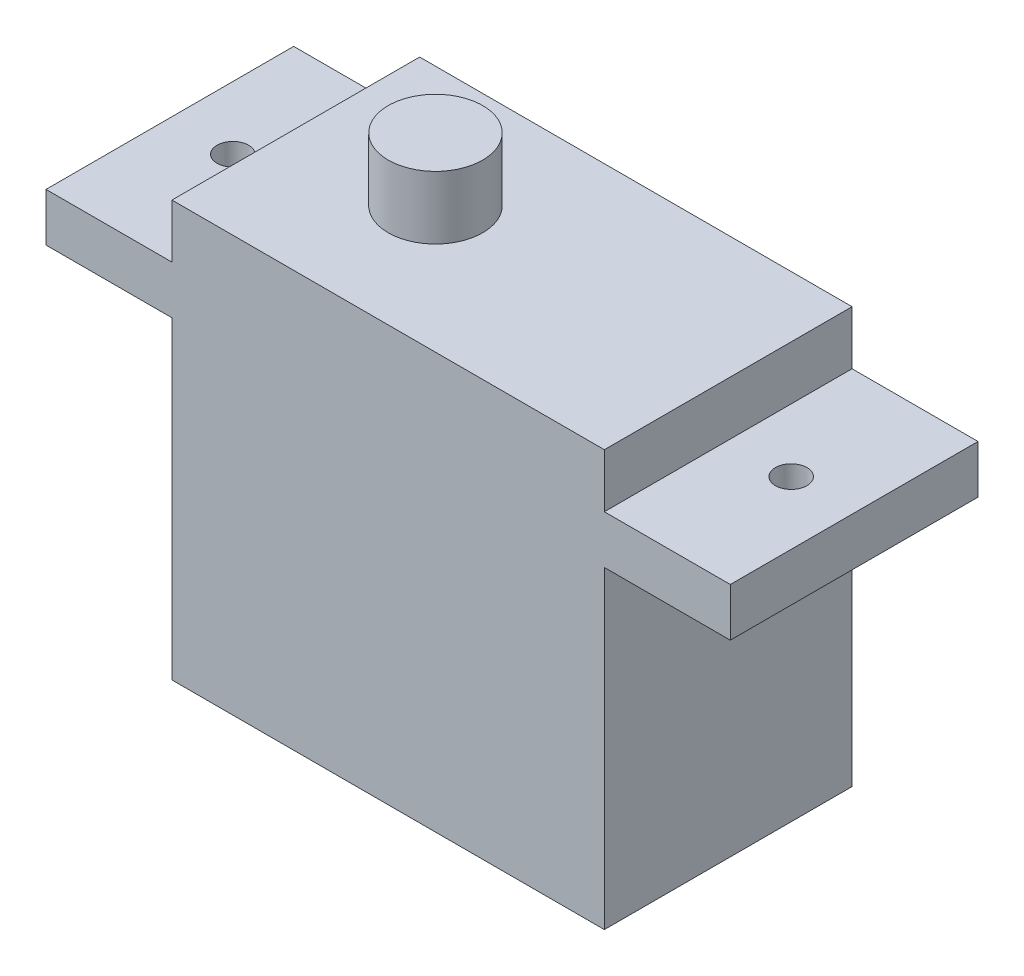
ISO-10303-21;
HEADER;
FILE_DESCRIPTION(('STEP AP214'),'2;1');
FILE_NAME('part.step','',(''),(''),'','','');
FILE_SCHEMA(('AUTOMOTIVE_DESIGN { 1 0 10303 214 1 1 1 1 }'));
ENDSEC;
DATA;
#1=APPLICATION_CONTEXT('core data for automotive mechanical design processes');
#2=APPLICATION_PROTOCOL_DEFINITION('international standard','automotive_design',2000,#1);
#3=PRODUCT_CONTEXT('',#1,'mechanical');
#4=PRODUCT('Part','Part','',(#3));
#5=PRODUCT_RELATED_PRODUCT_CATEGORY('part','',(#4));
#6=PRODUCT_DEFINITION_FORMATION('','',#4);
#7=PRODUCT_DEFINITION_CONTEXT('part definition',#1,'design');
#8=PRODUCT_DEFINITION('design','',#6,#7);
#9=PRODUCT_DEFINITION_SHAPE('','',#8);
#10=(LENGTH_UNIT() NAMED_UNIT(*) SI_UNIT(.MILLI.,.METRE.));
#11=(NAMED_UNIT(*) PLANE_ANGLE_UNIT() SI_UNIT($,.RADIAN.));
#12=(NAMED_UNIT(*) SI_UNIT($,.STERADIAN.) SOLID_ANGLE_UNIT());
#13=UNCERTAINTY_MEASURE_WITH_UNIT(LENGTH_MEASURE(1.E-05),#10,'distance_accuracy_value','');
#14=(GEOMETRIC_REPRESENTATION_CONTEXT(3) GLOBAL_UNCERTAINTY_ASSIGNED_CONTEXT((#13)) GLOBAL_UNIT_ASSIGNED_CONTEXT((#10,
#11,#12)) REPRESENTATION_CONTEXT('',''));
#15=CARTESIAN_POINT('',(0.,0.,0.));
#16=DIRECTION('',(0.,0.,1.));
#17=DIRECTION('',(1.,0.,0.));
#18=AXIS2_PLACEMENT_3D('',#15,#16,#17);
#19=CARTESIAN_POINT('',(10.3,11.4,11.8));
#20=DIRECTION('',(-1.,0.,0.));
#21=DIRECTION('',(0.,-1.,0.));
#22=AXIS2_PLACEMENT_3D('',#19,#20,#21);
#23=PLANE('',#22);
#24=DIRECTION('',(0.,1.,0.));
#25=VECTOR('',#24,1.);
#26=CARTESIAN_POINT('',(10.3,11.4,0.));
#27=LINE('',#26,#25);
#28=CARTESIAN_POINT('',(10.3,5.83954099218431,0.));
#29=VERTEX_POINT('',#28);
#30=CARTESIAN_POINT('',(10.3,8.4,0.));
#31=VERTEX_POINT('',#30);
#32=EDGE_CURVE('E187',#29,#31,#27,.T.);
#33=ORIENTED_EDGE('',*,*,#32,.T.);
#34=DIRECTION('',(0.,0.,1.));
#35=VECTOR('',#34,1.);
#36=CARTESIAN_POINT('',(10.3,8.4,11.8));
#37=LINE('',#36,#35);
#38=CARTESIAN_POINT('',(10.3,8.4,11.8));
#39=VERTEX_POINT('',#38);
#40=EDGE_CURVE('E59',#31,#39,#37,.T.);
#41=ORIENTED_EDGE('',*,*,#40,.T.);
#42=DIRECTION('',(0.,1.,0.));
#43=VECTOR('',#42,1.);
#44=CARTESIAN_POINT('',(10.3,11.4,11.8));
#45=LINE('',#44,#43);
#46=CARTESIAN_POINT('',(10.3,5.83954099218431,11.8));
#47=VERTEX_POINT('',#46);
#48=EDGE_CURVE('E158',#47,#39,#45,.T.);
#49=ORIENTED_EDGE('',*,*,#48,.F.);
#50=DIRECTION('',(0.,0.,-1.));
#51=VECTOR('',#50,1.);
#52=CARTESIAN_POINT('',(10.3,5.83954099218431,11.8));
#53=LINE('',#52,#51);
#54=EDGE_CURVE('E189',#47,#29,#53,.T.);
#55=ORIENTED_EDGE('',*,*,#54,.T.);
#56=EDGE_LOOP('',(#33,#41,#49,#55));
#57=FACE_BOUND('',#56,.T.);
#58=ADVANCED_FACE('F42',(#57),#23,.F.);
#59=CARTESIAN_POINT('',(-10.3,11.4,11.8));
#60=DIRECTION('',(1.,0.,0.));
#61=DIRECTION('',(0.,1.,0.));
#62=AXIS2_PLACEMENT_3D('',#59,#60,#61);
#63=PLANE('',#62);
#64=DIRECTION('',(0.,-1.,0.));
#65=VECTOR('',#64,1.);
#66=CARTESIAN_POINT('',(-10.3,11.4,11.8));
#67=LINE('',#66,#65);
#68=CARTESIAN_POINT('',(-10.3,8.4,11.8));
#69=VERTEX_POINT('',#68);
#70=CARTESIAN_POINT('',(-10.3,5.83954099218431,11.8));
#71=VERTEX_POINT('',#70);
#72=EDGE_CURVE('E144',#69,#71,#67,.T.);
#73=ORIENTED_EDGE('',*,*,#72,.F.);
#74=DIRECTION('',(0.,0.,-1.));
#75=VECTOR('',#74,1.);
#76=CARTESIAN_POINT('',(-10.3,8.4,11.8));
#77=LINE('',#76,#75);
#78=CARTESIAN_POINT('',(-10.3,8.4,0.));
#79=VERTEX_POINT('',#78);
#80=EDGE_CURVE('E132',#69,#79,#77,.T.);
#81=ORIENTED_EDGE('',*,*,#80,.T.);
#82=DIRECTION('',(0.,-1.,0.));
#83=VECTOR('',#82,1.);
#84=CARTESIAN_POINT('',(-10.3,11.4,0.));
#85=LINE('',#84,#83);
#86=CARTESIAN_POINT('',(-10.3,5.83954099218431,0.));
#87=VERTEX_POINT('',#86);
#88=EDGE_CURVE('E142',#79,#87,#85,.T.);
#89=ORIENTED_EDGE('',*,*,#88,.T.);
#90=DIRECTION('',(0.,0.,1.));
#91=VECTOR('',#90,1.);
#92=CARTESIAN_POINT('',(-10.3,5.83954099218431,11.8));
#93=LINE('',#92,#91);
#94=EDGE_CURVE('E193',#87,#71,#93,.T.);
#95=ORIENTED_EDGE('',*,*,#94,.T.);
#96=EDGE_LOOP('',(#73,#81,#89,#95));
#97=FACE_BOUND('',#96,.T.);
#98=ADVANCED_FACE('F140',(#97),#63,.F.);
#99=CARTESIAN_POINT('',(10.3,-11.4,0.));
#100=VERTEX_POINT('',#99);
#101=CARTESIAN_POINT('',(10.3,3.54155444371429,0.));
#102=VERTEX_POINT('',#101);
#103=EDGE_CURVE('E160',#100,#102,#27,.T.);
#104=ORIENTED_EDGE('',*,*,#103,.T.);
#105=DIRECTION('',(0.,0.,1.));
#106=VECTOR('',#105,1.);
#107=CARTESIAN_POINT('',(10.3,3.54155444371429,11.8));
#108=LINE('',#107,#106);
#109=CARTESIAN_POINT('',(10.3,3.54155444371429,11.8));
#110=VERTEX_POINT('',#109);
#111=EDGE_CURVE('E197',#102,#110,#108,.T.);
#112=ORIENTED_EDGE('',*,*,#111,.T.);
#113=CARTESIAN_POINT('',(10.3,-11.4,11.8));
#114=VERTEX_POINT('',#113);
#115=EDGE_CURVE('E201',#114,#110,#45,.T.);
#116=ORIENTED_EDGE('',*,*,#115,.F.);
#117=DIRECTION('',(0.,0.,-1.));
#118=VECTOR('',#117,1.);
#119=CARTESIAN_POINT('',(10.3,-11.4,11.8));
#120=LINE('',#119,#118);
#121=EDGE_CURVE('E164',#114,#100,#120,.T.);
#122=ORIENTED_EDGE('',*,*,#121,.T.);
#123=EDGE_LOOP('',(#104,#112,#116,#122));
#124=FACE_BOUND('',#123,.T.);
#125=ADVANCED_FACE('F44',(#124),#23,.F.);
#126=CARTESIAN_POINT('',(-10.3,3.54155444371429,11.8));
#127=VERTEX_POINT('',#126);
#128=CARTESIAN_POINT('',(-10.3,-11.4,11.8));
#129=VERTEX_POINT('',#128);
#130=EDGE_CURVE('E205',#127,#129,#67,.T.);
#131=ORIENTED_EDGE('',*,*,#130,.F.);
#132=DIRECTION('',(0.,0.,-1.));
#133=VECTOR('',#132,1.);
#134=CARTESIAN_POINT('',(-10.3,3.54155444371429,11.8));
#135=LINE('',#134,#133);
#136=CARTESIAN_POINT('',(-10.3,3.54155444371429,0.));
#137=VERTEX_POINT('',#136);
#138=EDGE_CURVE('E213',#127,#137,#135,.T.);
#139=ORIENTED_EDGE('',*,*,#138,.T.);
#140=CARTESIAN_POINT('',(-10.3,-11.4,0.));
#141=VERTEX_POINT('',#140);
#142=EDGE_CURVE('E154',#137,#141,#85,.T.);
#143=ORIENTED_EDGE('',*,*,#142,.T.);
#144=DIRECTION('',(0.,0.,-1.));
#145=VECTOR('',#144,1.);
#146=CARTESIAN_POINT('',(-10.3,-11.4,11.8));
#147=LINE('',#146,#145);
#148=EDGE_CURVE('E52',#129,#141,#147,.T.);
#149=ORIENTED_EDGE('',*,*,#148,.F.);
#150=EDGE_LOOP('',(#131,#139,#143,#149));
#151=FACE_BOUND('',#150,.T.);
#152=ADVANCED_FACE('F303',(#151),#63,.F.);
#153=CARTESIAN_POINT('',(-10.3,-11.4,11.8));
#154=DIRECTION('',(0.,1.,0.));
#155=DIRECTION('',(0.,0.,1.));
#156=AXIS2_PLACEMENT_3D('',#153,#154,#155);
#157=PLANE('',#156);
#158=DIRECTION('',(1.,0.,0.));
#159=VECTOR('',#158,1.);
#160=CARTESIAN_POINT('',(-10.3,-11.4,0.));
#161=LINE('',#160,#159);
#162=EDGE_CURVE('E153',#141,#100,#161,.T.);
#163=ORIENTED_EDGE('',*,*,#162,.T.);
#164=ORIENTED_EDGE('',*,*,#121,.F.);
#165=DIRECTION('',(1.,0.,0.));
#166=VECTOR('',#165,1.);
#167=CARTESIAN_POINT('',(-10.3,-11.4,11.8));
#168=LINE('',#167,#166);
#169=EDGE_CURVE('E168',#129,#114,#168,.T.);
#170=ORIENTED_EDGE('',*,*,#169,.F.);
#171=ORIENTED_EDGE('',*,*,#148,.T.);
#172=EDGE_LOOP('',(#163,#164,#170,#171));
#173=FACE_BOUND('',#172,.T.);
#174=ADVANCED_FACE('F175',(#173),#157,.F.);
#175=CARTESIAN_POINT('',(10.3,-11.4,11.8));
#176=DIRECTION('',(0.,0.,1.));
#177=DIRECTION('',(1.,0.,0.));
#178=AXIS2_PLACEMENT_3D('',#175,#176,#177);
#179=PLANE('',#178);
#180=DIRECTION('',(1.,0.,0.));
#181=VECTOR('',#180,1.);
#182=CARTESIAN_POINT('',(10.3,8.4,11.8));
#183=LINE('',#182,#181);
#184=EDGE_CURVE('E263',#69,#39,#183,.T.);
#185=ORIENTED_EDGE('',*,*,#184,.F.);
#186=ORIENTED_EDGE('',*,*,#72,.T.);
#187=DIRECTION('',(1.,0.,0.));
#188=VECTOR('',#187,1.);
#189=CARTESIAN_POINT('',(-16.3,5.83954099218431,11.8));
#190=LINE('',#189,#188);
#191=CARTESIAN_POINT('',(-16.3,5.83954099218431,11.8));
#192=VERTEX_POINT('',#191);
#193=EDGE_CURVE('E216',#192,#71,#190,.T.);
#194=ORIENTED_EDGE('',*,*,#193,.F.);
#195=DIRECTION('',(0.,-1.,0.));
#196=VECTOR('',#195,1.);
#197=CARTESIAN_POINT('',(-16.3,3.54155444371429,11.8));
#198=LINE('',#197,#196);
#199=CARTESIAN_POINT('',(-16.3,3.54155444371429,11.8));
#200=VERTEX_POINT('',#199);
#201=EDGE_CURVE('E243',#192,#200,#198,.T.);
#202=ORIENTED_EDGE('',*,*,#201,.T.);
#203=DIRECTION('',(1.,0.,0.));
#204=VECTOR('',#203,1.);
#205=CARTESIAN_POINT('',(-16.3,3.54155444371429,11.8));
#206=LINE('',#205,#204);
#207=EDGE_CURVE('E219',#200,#127,#206,.T.);
#208=ORIENTED_EDGE('',*,*,#207,.T.);
#209=ORIENTED_EDGE('',*,*,#130,.T.);
#210=ORIENTED_EDGE('',*,*,#169,.T.);
#211=ORIENTED_EDGE('',*,*,#115,.T.);
#212=CARTESIAN_POINT('',(16.3,3.54155444371429,11.8));
#213=VERTEX_POINT('',#212);
#214=EDGE_CURVE('E66',#110,#213,#206,.T.);
#215=ORIENTED_EDGE('',*,*,#214,.T.);
#216=DIRECTION('',(0.,-1.,0.));
#217=VECTOR('',#216,1.);
#218=CARTESIAN_POINT('',(16.3,3.54155444371429,11.8));
#219=LINE('',#218,#217);
#220=CARTESIAN_POINT('',(16.3,5.83954099218431,11.8));
#221=VERTEX_POINT('',#220);
#222=EDGE_CURVE('E259',#221,#213,#219,.T.);
#223=ORIENTED_EDGE('',*,*,#222,.F.);
#224=EDGE_CURVE('E228',#47,#221,#190,.T.);
#225=ORIENTED_EDGE('',*,*,#224,.F.);
#226=ORIENTED_EDGE('',*,*,#48,.T.);
#227=EDGE_LOOP('',(#185,#186,#194,#202,#208,#209,#210,#211,#215,#223,#225,#226));
#228=FACE_BOUND('',#227,.T.);
#229=ADVANCED_FACE('F209',(#228),#179,.T.);
#230=CARTESIAN_POINT('',(10.3,-11.4,0.));
#231=DIRECTION('',(0.,0.,1.));
#232=DIRECTION('',(1.,0.,0.));
#233=AXIS2_PLACEMENT_3D('',#230,#231,#232);
#234=PLANE('',#233);
#235=ORIENTED_EDGE('',*,*,#88,.F.);
#236=DIRECTION('',(1.,0.,0.));
#237=VECTOR('',#236,1.);
#238=CARTESIAN_POINT('',(10.3,8.4,0.));
#239=LINE('',#238,#237);
#240=EDGE_CURVE('E11',#79,#31,#239,.T.);
#241=ORIENTED_EDGE('',*,*,#240,.T.);
#242=ORIENTED_EDGE('',*,*,#32,.F.);
#243=DIRECTION('',(1.,0.,0.));
#244=VECTOR('',#243,1.);
#245=CARTESIAN_POINT('',(-16.3,5.83954099218431,0.));
#246=LINE('',#245,#244);
#247=CARTESIAN_POINT('',(16.3,5.83954099218431,0.));
#248=VERTEX_POINT('',#247);
#249=EDGE_CURVE('E225',#29,#248,#246,.T.);
#250=ORIENTED_EDGE('',*,*,#249,.T.);
#251=DIRECTION('',(0.,1.,0.));
#252=VECTOR('',#251,1.);
#253=CARTESIAN_POINT('',(16.3,5.83954099218431,0.));
#254=LINE('',#253,#252);
#255=CARTESIAN_POINT('',(16.3,3.54155444371429,0.));
#256=VERTEX_POINT('',#255);
#257=EDGE_CURVE('E251',#256,#248,#254,.T.);
#258=ORIENTED_EDGE('',*,*,#257,.F.);
#259=DIRECTION('',(1.,0.,0.));
#260=VECTOR('',#259,1.);
#261=CARTESIAN_POINT('',(-16.3,3.54155444371429,0.));
#262=LINE('',#261,#260);
#263=EDGE_CURVE('E184',#102,#256,#262,.T.);
#264=ORIENTED_EDGE('',*,*,#263,.F.);
#265=ORIENTED_EDGE('',*,*,#103,.F.);
#266=ORIENTED_EDGE('',*,*,#162,.F.);
#267=ORIENTED_EDGE('',*,*,#142,.F.);
#268=CARTESIAN_POINT('',(-16.3,3.54155444371429,0.));
#269=VERTEX_POINT('',#268);
#270=EDGE_CURVE('E222',#269,#137,#262,.T.);
#271=ORIENTED_EDGE('',*,*,#270,.F.);
#272=DIRECTION('',(0.,1.,0.));
#273=VECTOR('',#272,1.);
#274=CARTESIAN_POINT('',(-16.3,5.83954099218431,0.));
#275=LINE('',#274,#273);
#276=CARTESIAN_POINT('',(-16.3,5.83954099218431,0.));
#277=VERTEX_POINT('',#276);
#278=EDGE_CURVE('E236',#269,#277,#275,.T.);
#279=ORIENTED_EDGE('',*,*,#278,.T.);
#280=EDGE_CURVE('E151',#277,#87,#246,.T.);
#281=ORIENTED_EDGE('',*,*,#280,.T.);
#282=EDGE_LOOP('',(#235,#241,#242,#250,#258,#264,#265,#266,#267,#271,#279,#281));
#283=FACE_BOUND('',#282,.T.);
#284=ADVANCED_FACE('F149',(#283),#234,.F.);
#285=CARTESIAN_POINT('',(-16.3,5.83954099218431,11.8));
#286=DIRECTION('',(-1.,0.,0.));
#287=DIRECTION('',(0.,0.,1.));
#288=AXIS2_PLACEMENT_3D('',#285,#286,#287);
#289=PLANE('',#288);
#290=ORIENTED_EDGE('',*,*,#201,.F.);
#291=DIRECTION('',(0.,0.,1.));
#292=VECTOR('',#291,1.);
#293=CARTESIAN_POINT('',(-16.3,5.83954099218431,11.8));
#294=LINE('',#293,#292);
#295=EDGE_CURVE('E232',#277,#192,#294,.T.);
#296=ORIENTED_EDGE('',*,*,#295,.F.);
#297=ORIENTED_EDGE('',*,*,#278,.F.);
#298=DIRECTION('',(0.,0.,-1.));
#299=VECTOR('',#298,1.);
#300=CARTESIAN_POINT('',(-16.3,3.54155444371429,0.));
#301=LINE('',#300,#299);
#302=EDGE_CURVE('E239',#200,#269,#301,.T.);
#303=ORIENTED_EDGE('',*,*,#302,.F.);
#304=EDGE_LOOP('',(#290,#296,#297,#303));
#305=FACE_BOUND('',#304,.T.);
#306=ADVANCED_FACE('F300',(#305),#289,.T.);
#307=CARTESIAN_POINT('',(-16.3,3.54155444371429,0.));
#308=DIRECTION('',(0.,-1.,0.));
#309=DIRECTION('',(0.,0.,-1.));
#310=AXIS2_PLACEMENT_3D('',#307,#308,#309);
#311=PLANE('',#310);
#312=CARTESIAN_POINT('',(-13.3,3.54155444371429,5.9));
#313=DIRECTION('',(0.,-1.,0.));
#314=DIRECTION('',(0.,0.,-1.));
#315=AXIS2_PLACEMENT_3D('',#312,#313,#314);
#316=CIRCLE('',#315,0.75);
#317=CARTESIAN_POINT('',(-13.3,3.54155444371429,5.15));
#318=VERTEX_POINT('',#317);
#319=EDGE_CURVE('E279',#318,#318,#316,.T.);
#320=ORIENTED_EDGE('',*,*,#319,.F.);
#321=EDGE_LOOP('',(#320));
#322=FACE_BOUND('',#321,.T.);
#323=ORIENTED_EDGE('',*,*,#138,.F.);
#324=ORIENTED_EDGE('',*,*,#207,.F.);
#325=ORIENTED_EDGE('',*,*,#302,.T.);
#326=ORIENTED_EDGE('',*,*,#270,.T.);
#327=EDGE_LOOP('',(#323,#324,#325,#326));
#328=FACE_BOUND('',#327,.T.);
#329=ADVANCED_FACE('F294',(#322,#328),#311,.T.);
#330=CARTESIAN_POINT('',(-16.3,5.83954099218431,11.8));
#331=DIRECTION('',(0.,1.,0.));
#332=DIRECTION('',(-1.,0.,0.));
#333=AXIS2_PLACEMENT_3D('',#330,#331,#332);
#334=PLANE('',#333);
#335=CARTESIAN_POINT('',(-13.3,5.83954099218431,5.9));
#336=DIRECTION('',(0.,1.,0.));
#337=DIRECTION('',(-1.,0.,0.));
#338=AXIS2_PLACEMENT_3D('',#335,#336,#337);
#339=CIRCLE('',#338,0.75);
#340=CARTESIAN_POINT('',(-14.05,5.83954099218431,5.9));
#341=VERTEX_POINT('',#340);
#342=EDGE_CURVE('E283',#341,#341,#339,.T.);
#343=ORIENTED_EDGE('',*,*,#342,.F.);
#344=EDGE_LOOP('',(#343));
#345=FACE_BOUND('',#344,.T.);
#346=ORIENTED_EDGE('',*,*,#94,.F.);
#347=ORIENTED_EDGE('',*,*,#280,.F.);
#348=ORIENTED_EDGE('',*,*,#295,.T.);
#349=ORIENTED_EDGE('',*,*,#193,.T.);
#350=EDGE_LOOP('',(#346,#347,#348,#349));
#351=FACE_BOUND('',#350,.T.);
#352=ADVANCED_FACE('F290',(#345,#351),#334,.T.);
#353=CARTESIAN_POINT('',(13.3,5.83954099218431,5.9));
#354=DIRECTION('',(0.,1.,0.));
#355=DIRECTION('',(-1.,0.,0.));
#356=AXIS2_PLACEMENT_3D('',#353,#354,#355);
#357=CIRCLE('',#356,0.75);
#358=CARTESIAN_POINT('',(12.55,5.83954099218431,5.9));
#359=VERTEX_POINT('',#358);
#360=EDGE_CURVE('E275',#359,#359,#357,.T.);
#361=ORIENTED_EDGE('',*,*,#360,.F.);
#362=EDGE_LOOP('',(#361));
#363=FACE_BOUND('',#362,.T.);
#364=ORIENTED_EDGE('',*,*,#54,.F.);
#365=ORIENTED_EDGE('',*,*,#224,.T.);
#366=DIRECTION('',(0.,0.,1.));
#367=VECTOR('',#366,1.);
#368=CARTESIAN_POINT('',(16.3,5.83954099218431,11.8));
#369=LINE('',#368,#367);
#370=EDGE_CURVE('E247',#248,#221,#369,.T.);
#371=ORIENTED_EDGE('',*,*,#370,.F.);
#372=ORIENTED_EDGE('',*,*,#249,.F.);
#373=EDGE_LOOP('',(#364,#365,#371,#372));
#374=FACE_BOUND('',#373,.T.);
#375=ADVANCED_FACE('F293',(#363,#374),#334,.T.);
#376=CARTESIAN_POINT('',(13.3,3.54155444371429,5.9));
#377=DIRECTION('',(0.,-1.,0.));
#378=DIRECTION('',(0.,0.,-1.));
#379=AXIS2_PLACEMENT_3D('',#376,#377,#378);
#380=CIRCLE('',#379,0.75);
#381=CARTESIAN_POINT('',(13.3,3.54155444371429,5.15));
#382=VERTEX_POINT('',#381);
#383=EDGE_CURVE('E46',#382,#382,#380,.T.);
#384=ORIENTED_EDGE('',*,*,#383,.F.);
#385=EDGE_LOOP('',(#384));
#386=FACE_BOUND('',#385,.T.);
#387=ORIENTED_EDGE('',*,*,#111,.F.);
#388=ORIENTED_EDGE('',*,*,#263,.T.);
#389=DIRECTION('',(0.,0.,-1.));
#390=VECTOR('',#389,1.);
#391=CARTESIAN_POINT('',(16.3,3.54155444371429,0.));
#392=LINE('',#391,#390);
#393=EDGE_CURVE('E255',#213,#256,#392,.T.);
#394=ORIENTED_EDGE('',*,*,#393,.F.);
#395=ORIENTED_EDGE('',*,*,#214,.F.);
#396=EDGE_LOOP('',(#387,#388,#394,#395));
#397=FACE_BOUND('',#396,.T.);
#398=ADVANCED_FACE('F347',(#386,#397),#311,.T.);
#399=CARTESIAN_POINT('',(16.3,5.83954099218431,11.8));
#400=DIRECTION('',(-1.,0.,0.));
#401=DIRECTION('',(0.,0.,1.));
#402=AXIS2_PLACEMENT_3D('',#399,#400,#401);
#403=PLANE('',#402);
#404=ORIENTED_EDGE('',*,*,#222,.T.);
#405=ORIENTED_EDGE('',*,*,#393,.T.);
#406=ORIENTED_EDGE('',*,*,#257,.T.);
#407=ORIENTED_EDGE('',*,*,#370,.T.);
#408=EDGE_LOOP('',(#404,#405,#406,#407));
#409=FACE_BOUND('',#408,.T.);
#410=ADVANCED_FACE('F341',(#409),#403,.F.);
#411=CARTESIAN_POINT('',(-11.0733765948083,8.4,-1.79611614356645));
#412=DIRECTION('',(0.,-1.,0.));
#413=DIRECTION('',(0.,0.,-1.));
#414=AXIS2_PLACEMENT_3D('',#411,#412,#413);
#415=PLANE('',#414);
#416=ORIENTED_EDGE('',*,*,#184,.T.);
#417=ORIENTED_EDGE('',*,*,#40,.F.);
#418=ORIENTED_EDGE('',*,*,#240,.F.);
#419=ORIENTED_EDGE('',*,*,#80,.F.);
#420=EDGE_LOOP('',(#416,#417,#418,#419));
#421=FACE_BOUND('',#420,.T.);
#422=CARTESIAN_POINT('',(-3.79653304827343,8.4,5.74964957601765));
#423=DIRECTION('',(0.,1.,0.));
#424=DIRECTION('',(0.,0.,1.));
#425=AXIS2_PLACEMENT_3D('',#422,#423,#424);
#426=CIRCLE('',#425,2.25);
#427=CARTESIAN_POINT('',(-3.79653304827343,8.4,7.99964957601765));
#428=VERTEX_POINT('',#427);
#429=EDGE_CURVE('E146',#428,#428,#426,.T.);
#430=ORIENTED_EDGE('',*,*,#429,.F.);
#431=EDGE_LOOP('',(#430));
#432=FACE_BOUND('',#431,.T.);
#433=ADVANCED_FACE('F130',(#421,#432),#415,.F.);
#434=CARTESIAN_POINT('',(-3.79653304827343,8.4,5.74964957601765));
#435=DIRECTION('',(0.,1.,0.));
#436=DIRECTION('',(0.,0.,1.));
#437=AXIS2_PLACEMENT_3D('',#434,#435,#436);
#438=CYLINDRICAL_SURFACE('',#437,2.25);
#439=ORIENTED_EDGE('',*,*,#429,.T.);
#440=EDGE_LOOP('',(#439));
#441=FACE_BOUND('',#440,.T.);
#442=CARTESIAN_POINT('',(-3.79653304827343,11.4,5.74964957601765));
#443=DIRECTION('',(0.,1.,0.));
#444=DIRECTION('',(0.,0.,1.));
#445=AXIS2_PLACEMENT_3D('',#442,#443,#444);
#446=CIRCLE('',#445,2.25);
#447=CARTESIAN_POINT('',(-3.79653304827343,11.4,7.99964957601765));
#448=VERTEX_POINT('',#447);
#449=EDGE_CURVE('E268',#448,#448,#446,.T.);
#450=ORIENTED_EDGE('',*,*,#449,.F.);
#451=EDGE_LOOP('',(#450));
#452=FACE_BOUND('',#451,.T.);
#453=ADVANCED_FACE('F326',(#441,#452),#438,.T.);
#454=CARTESIAN_POINT('',(-10.3,11.4,11.8));
#455=DIRECTION('',(0.,-1.,0.));
#456=DIRECTION('',(0.,0.,-1.));
#457=AXIS2_PLACEMENT_3D('',#454,#455,#456);
#458=PLANE('',#457);
#459=ORIENTED_EDGE('',*,*,#449,.T.);
#460=EDGE_LOOP('',(#459));
#461=FACE_BOUND('',#460,.T.);
#462=ADVANCED_FACE('F323',(#461),#458,.F.);
#463=CARTESIAN_POINT('',(13.3,-4.16045900781569,5.9));
#464=DIRECTION('',(0.,1.,0.));
#465=DIRECTION('',(-1.,0.,0.));
#466=AXIS2_PLACEMENT_3D('',#463,#464,#465);
#467=CYLINDRICAL_SURFACE('',#466,0.75);
#468=ORIENTED_EDGE('',*,*,#383,.T.);
#469=EDGE_LOOP('',(#468));
#470=FACE_BOUND('',#469,.T.);
#471=ORIENTED_EDGE('',*,*,#360,.T.);
#472=EDGE_LOOP('',(#471));
#473=FACE_BOUND('',#472,.T.);
#474=ADVANCED_FACE('F325',(#470,#473),#467,.F.);
#475=CARTESIAN_POINT('',(-13.3,-4.16045900781569,5.9));
#476=DIRECTION('',(0.,1.,0.));
#477=DIRECTION('',(-1.,0.,0.));
#478=AXIS2_PLACEMENT_3D('',#475,#476,#477);
#479=CYLINDRICAL_SURFACE('',#478,0.75);
#480=ORIENTED_EDGE('',*,*,#319,.T.);
#481=EDGE_LOOP('',(#480));
#482=FACE_BOUND('',#481,.T.);
#483=ORIENTED_EDGE('',*,*,#342,.T.);
#484=EDGE_LOOP('',(#483));
#485=FACE_BOUND('',#484,.T.);
#486=ADVANCED_FACE('F288',(#482,#485),#479,.F.);
#487=CLOSED_SHELL('',(#58,#98,#125,#152,#174,#229,#284,#306,#329,#352,#375,#398,#410,#433,#453,
#462,#474,#486));
#488=MANIFOLD_SOLID_BREP('B2',#487);
#489=ADVANCED_BREP_SHAPE_REPRESENTATION('',(#18,#488),#14);
#490=SHAPE_DEFINITION_REPRESENTATION(#9,#489);
ENDSEC;
END-ISO-10303-21;
